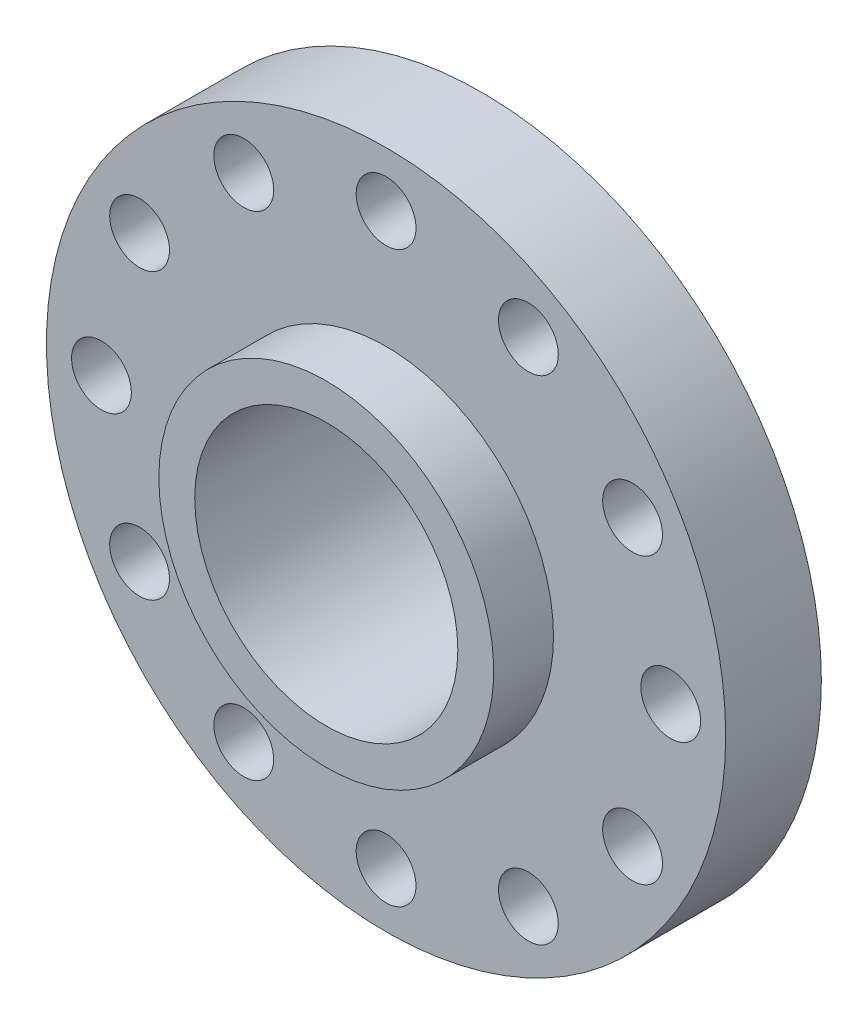
ISO-10303-21;
HEADER;
FILE_DESCRIPTION(('STEP AP214'),'2;1');
FILE_NAME('part.step','',(''),(''),'','','');
FILE_SCHEMA(('AUTOMOTIVE_DESIGN { 1 0 10303 214 1 1 1 1 }'));
ENDSEC;
DATA;
#1=APPLICATION_CONTEXT('core data for automotive mechanical design processes');
#2=APPLICATION_PROTOCOL_DEFINITION('international standard','automotive_design',2000,#1);
#3=PRODUCT_CONTEXT('',#1,'mechanical');
#4=PRODUCT('Part','Part','',(#3));
#5=PRODUCT_RELATED_PRODUCT_CATEGORY('part','',(#4));
#6=PRODUCT_DEFINITION_FORMATION('','',#4);
#7=PRODUCT_DEFINITION_CONTEXT('part definition',#1,'design');
#8=PRODUCT_DEFINITION('design','',#6,#7);
#9=PRODUCT_DEFINITION_SHAPE('','',#8);
#10=(LENGTH_UNIT() NAMED_UNIT(*) SI_UNIT(.MILLI.,.METRE.));
#11=(NAMED_UNIT(*) PLANE_ANGLE_UNIT() SI_UNIT($,.RADIAN.));
#12=(NAMED_UNIT(*) SI_UNIT($,.STERADIAN.) SOLID_ANGLE_UNIT());
#13=UNCERTAINTY_MEASURE_WITH_UNIT(LENGTH_MEASURE(1.E-05),#10,'distance_accuracy_value','');
#14=(GEOMETRIC_REPRESENTATION_CONTEXT(3) GLOBAL_UNCERTAINTY_ASSIGNED_CONTEXT((#13)) GLOBAL_UNIT_ASSIGNED_CONTEXT((#10,
#11,#12)) REPRESENTATION_CONTEXT('',''));
#15=CARTESIAN_POINT('',(0.,0.,0.));
#16=DIRECTION('',(0.,0.,1.));
#17=DIRECTION('',(1.,0.,0.));
#18=AXIS2_PLACEMENT_3D('',#15,#16,#17);
#19=CARTESIAN_POINT('',(0.,0.,4.96));
#20=DIRECTION('',(0.,0.,1.));
#21=DIRECTION('',(1.,0.,0.));
#22=AXIS2_PLACEMENT_3D('',#19,#20,#21);
#23=PLANE('',#22);
#24=CARTESIAN_POINT('',(2.85600000000004,4.94673710641669,4.96));
#25=DIRECTION('',(0.,0.,1.));
#26=DIRECTION('',(1.,0.,0.));
#27=AXIS2_PLACEMENT_3D('',#24,#25,#26);
#28=CIRCLE('',#27,0.6);
#29=CARTESIAN_POINT('',(3.45600000000004,4.94673710641669,4.96));
#30=VERTEX_POINT('',#29);
#31=EDGE_CURVE('E80',#30,#30,#28,.T.);
#32=ORIENTED_EDGE('',*,*,#31,.F.);
#33=EDGE_LOOP('',(#32));
#34=FACE_BOUND('',#33,.T.);
#35=CARTESIAN_POINT('',(4.94673710641674,2.85599999999995,4.96));
#36=DIRECTION('',(0.,0.,1.));
#37=DIRECTION('',(1.,0.,0.));
#38=AXIS2_PLACEMENT_3D('',#35,#36,#37);
#39=CIRCLE('',#38,0.6);
#40=CARTESIAN_POINT('',(5.54673710641674,2.85599999999995,4.96));
#41=VERTEX_POINT('',#40);
#42=EDGE_CURVE('E83',#41,#41,#39,.T.);
#43=ORIENTED_EDGE('',*,*,#42,.F.);
#44=EDGE_LOOP('',(#43));
#45=FACE_BOUND('',#44,.T.);
#46=CARTESIAN_POINT('',(5.712,0.,4.96));
#47=DIRECTION('',(0.,0.,1.));
#48=DIRECTION('',(1.,0.,0.));
#49=AXIS2_PLACEMENT_3D('',#46,#47,#48);
#50=CIRCLE('',#49,0.6);
#51=CARTESIAN_POINT('',(6.312,0.,4.96));
#52=VERTEX_POINT('',#51);
#53=EDGE_CURVE('E86',#52,#52,#50,.T.);
#54=ORIENTED_EDGE('',*,*,#53,.F.);
#55=EDGE_LOOP('',(#54));
#56=FACE_BOUND('',#55,.T.);
#57=CARTESIAN_POINT('',(4.94673710641668,-2.85600000000006,4.96));
#58=DIRECTION('',(0.,0.,1.));
#59=DIRECTION('',(1.,0.,0.));
#60=AXIS2_PLACEMENT_3D('',#57,#58,#59);
#61=CIRCLE('',#60,0.6);
#62=CARTESIAN_POINT('',(5.54673710641668,-2.85600000000006,4.96));
#63=VERTEX_POINT('',#62);
#64=EDGE_CURVE('E89',#63,#63,#61,.T.);
#65=ORIENTED_EDGE('',*,*,#64,.F.);
#66=EDGE_LOOP('',(#65));
#67=FACE_BOUND('',#66,.T.);
#68=CARTESIAN_POINT('',(2.85599999999997,-4.94673710641673,4.96));
#69=DIRECTION('',(0.,0.,1.));
#70=DIRECTION('',(1.,0.,0.));
#71=AXIS2_PLACEMENT_3D('',#68,#69,#70);
#72=CIRCLE('',#71,0.6);
#73=CARTESIAN_POINT('',(3.45599999999997,-4.94673710641673,4.96));
#74=VERTEX_POINT('',#73);
#75=EDGE_CURVE('E92',#74,#74,#72,.T.);
#76=ORIENTED_EDGE('',*,*,#75,.F.);
#77=EDGE_LOOP('',(#76));
#78=FACE_BOUND('',#77,.T.);
#79=CARTESIAN_POINT('',(0.,-5.712,4.96));
#80=DIRECTION('',(0.,0.,1.));
#81=DIRECTION('',(1.,0.,0.));
#82=AXIS2_PLACEMENT_3D('',#79,#80,#81);
#83=CIRCLE('',#82,0.6);
#84=CARTESIAN_POINT('',(0.599999999999921,-5.712,4.96));
#85=VERTEX_POINT('',#84);
#86=EDGE_CURVE('E95',#85,#85,#83,.T.);
#87=ORIENTED_EDGE('',*,*,#86,.F.);
#88=EDGE_LOOP('',(#87));
#89=FACE_BOUND('',#88,.T.);
#90=CARTESIAN_POINT('',(-2.85600000000007,-4.94673710641667,4.96));
#91=DIRECTION('',(0.,0.,1.));
#92=DIRECTION('',(1.,0.,0.));
#93=AXIS2_PLACEMENT_3D('',#90,#91,#92);
#94=CIRCLE('',#93,0.6);
#95=CARTESIAN_POINT('',(-2.25600000000007,-4.94673710641667,4.96));
#96=VERTEX_POINT('',#95);
#97=EDGE_CURVE('E98',#96,#96,#94,.T.);
#98=ORIENTED_EDGE('',*,*,#97,.F.);
#99=EDGE_LOOP('',(#98));
#100=FACE_BOUND('',#99,.T.);
#101=CARTESIAN_POINT('',(-4.94673710641676,-2.85599999999992,4.96));
#102=DIRECTION('',(0.,0.,1.));
#103=DIRECTION('',(1.,0.,0.));
#104=AXIS2_PLACEMENT_3D('',#101,#102,#103);
#105=CIRCLE('',#104,0.6);
#106=CARTESIAN_POINT('',(-4.34673710641676,-2.85599999999992,4.96));
#107=VERTEX_POINT('',#106);
#108=EDGE_CURVE('E101',#107,#107,#105,.T.);
#109=ORIENTED_EDGE('',*,*,#108,.F.);
#110=EDGE_LOOP('',(#109));
#111=FACE_BOUND('',#110,.T.);
#112=CARTESIAN_POINT('',(-5.712,0.,4.96));
#113=DIRECTION('',(0.,0.,1.));
#114=DIRECTION('',(1.,0.,0.));
#115=AXIS2_PLACEMENT_3D('',#112,#113,#114);
#116=CIRCLE('',#115,0.6);
#117=CARTESIAN_POINT('',(-5.112,0.,4.96));
#118=VERTEX_POINT('',#117);
#119=EDGE_CURVE('E104',#118,#118,#116,.T.);
#120=ORIENTED_EDGE('',*,*,#119,.F.);
#121=EDGE_LOOP('',(#120));
#122=FACE_BOUND('',#121,.T.);
#123=CARTESIAN_POINT('',(-4.94673710641666,2.85600000000009,4.96));
#124=DIRECTION('',(0.,0.,1.));
#125=DIRECTION('',(1.,0.,0.));
#126=AXIS2_PLACEMENT_3D('',#123,#124,#125);
#127=CIRCLE('',#126,0.6);
#128=CARTESIAN_POINT('',(-4.34673710641666,2.85600000000009,4.96));
#129=VERTEX_POINT('',#128);
#130=EDGE_CURVE('E107',#129,#129,#127,.T.);
#131=ORIENTED_EDGE('',*,*,#130,.F.);
#132=EDGE_LOOP('',(#131));
#133=FACE_BOUND('',#132,.T.);
#134=CARTESIAN_POINT('',(0.,5.712,4.96));
#135=DIRECTION('',(0.,0.,1.));
#136=DIRECTION('',(1.,0.,0.));
#137=AXIS2_PLACEMENT_3D('',#134,#135,#136);
#138=CIRCLE('',#137,0.6);
#139=CARTESIAN_POINT('',(0.600000000000044,5.712,4.96));
#140=VERTEX_POINT('',#139);
#141=EDGE_CURVE('E74',#140,#140,#138,.T.);
#142=ORIENTED_EDGE('',*,*,#141,.F.);
#143=EDGE_LOOP('',(#142));
#144=FACE_BOUND('',#143,.T.);
#145=CARTESIAN_POINT('',(-2.85599999999997,4.94673710641673,4.96));
#146=DIRECTION('',(0.,0.,1.));
#147=DIRECTION('',(1.,0.,0.));
#148=AXIS2_PLACEMENT_3D('',#145,#146,#147);
#149=CIRCLE('',#148,0.6);
#150=CARTESIAN_POINT('',(-2.25599999999997,4.94673710641673,4.96));
#151=VERTEX_POINT('',#150);
#152=EDGE_CURVE('E68',#151,#151,#149,.T.);
#153=ORIENTED_EDGE('',*,*,#152,.F.);
#154=EDGE_LOOP('',(#153));
#155=FACE_BOUND('',#154,.T.);
#156=CARTESIAN_POINT('',(0.,0.,4.96));
#157=DIRECTION('',(0.,0.,1.));
#158=DIRECTION('',(1.,0.,0.));
#159=AXIS2_PLACEMENT_3D('',#156,#157,#158);
#160=CIRCLE('',#159,3.36);
#161=CARTESIAN_POINT('',(3.36,0.,4.96));
#162=VERTEX_POINT('',#161);
#163=EDGE_CURVE('E10',#162,#162,#160,.T.);
#164=ORIENTED_EDGE('',*,*,#163,.F.);
#165=EDGE_LOOP('',(#164));
#166=FACE_BOUND('',#165,.T.);
#167=CARTESIAN_POINT('',(0.,0.,4.96));
#168=DIRECTION('',(0.,0.,1.));
#169=DIRECTION('',(1.,0.,0.));
#170=AXIS2_PLACEMENT_3D('',#167,#168,#169);
#171=CIRCLE('',#170,6.816);
#172=CARTESIAN_POINT('',(6.816,0.,4.96));
#173=VERTEX_POINT('',#172);
#174=EDGE_CURVE('E47',#173,#173,#171,.T.);
#175=ORIENTED_EDGE('',*,*,#174,.T.);
#176=EDGE_LOOP('',(#175));
#177=FACE_BOUND('',#176,.T.);
#178=ADVANCED_FACE('F36',(#34,#45,#56,#67,#78,#89,#100,#111,#122,#133,#144,#155,#166,#177),#23,.T.);
#179=CARTESIAN_POINT('',(0.,0.,3.04));
#180=DIRECTION('',(0.,0.,1.));
#181=DIRECTION('',(1.,0.,0.));
#182=AXIS2_PLACEMENT_3D('',#179,#180,#181);
#183=PLANE('',#182);
#184=CARTESIAN_POINT('',(2.85600000000004,4.94673710641669,3.04));
#185=DIRECTION('',(0.,0.,-1.));
#186=DIRECTION('',(-0.499999999999998,0.86602540378444,0.));
#187=AXIS2_PLACEMENT_3D('',#184,#185,#186);
#188=CIRCLE('',#187,0.6);
#189=CARTESIAN_POINT('',(2.55600000000005,5.46635234868735,3.04));
#190=VERTEX_POINT('',#189);
#191=EDGE_CURVE('E110',#190,#190,#188,.T.);
#192=ORIENTED_EDGE('',*,*,#191,.F.);
#193=EDGE_LOOP('',(#192));
#194=FACE_BOUND('',#193,.T.);
#195=CARTESIAN_POINT('',(4.94673710641674,2.85599999999995,3.04));
#196=DIRECTION('',(0.,0.,-1.));
#197=DIRECTION('',(0.,1.,0.));
#198=AXIS2_PLACEMENT_3D('',#195,#196,#197);
#199=CIRCLE('',#198,0.6);
#200=CARTESIAN_POINT('',(4.94673710641674,3.45599999999995,3.04));
#201=VERTEX_POINT('',#200);
#202=EDGE_CURVE('E135',#201,#201,#199,.T.);
#203=ORIENTED_EDGE('',*,*,#202,.F.);
#204=EDGE_LOOP('',(#203));
#205=FACE_BOUND('',#204,.T.);
#206=CARTESIAN_POINT('',(5.712,0.,3.04));
#207=DIRECTION('',(0.,0.,-1.));
#208=DIRECTION('',(0.500000000000004,0.866025403784436,0.));
#209=AXIS2_PLACEMENT_3D('',#206,#207,#208);
#210=CIRCLE('',#209,0.6);
#211=CARTESIAN_POINT('',(6.01200000000001,0.519615242270597,3.04));
#212=VERTEX_POINT('',#211);
#213=EDGE_CURVE('E132',#212,#212,#210,.T.);
#214=ORIENTED_EDGE('',*,*,#213,.F.);
#215=EDGE_LOOP('',(#214));
#216=FACE_BOUND('',#215,.T.);
#217=CARTESIAN_POINT('',(4.94673710641668,-2.85600000000006,3.04));
#218=DIRECTION('',(0.,0.,-1.));
#219=DIRECTION('',(0.866025403784442,0.499999999999995,0.));
#220=AXIS2_PLACEMENT_3D('',#217,#218,#219);
#221=CIRCLE('',#220,0.6);
#222=CARTESIAN_POINT('',(5.46635234868735,-2.55600000000007,3.04));
#223=VERTEX_POINT('',#222);
#224=EDGE_CURVE('E129',#223,#223,#221,.T.);
#225=ORIENTED_EDGE('',*,*,#224,.F.);
#226=EDGE_LOOP('',(#225));
#227=FACE_BOUND('',#226,.T.);
#228=CARTESIAN_POINT('',(2.85599999999997,-4.94673710641673,3.04));
#229=DIRECTION('',(0.,0.,-1.));
#230=DIRECTION('',(1.,0.,0.));
#231=AXIS2_PLACEMENT_3D('',#228,#229,#230);
#232=CIRCLE('',#231,0.6);
#233=CARTESIAN_POINT('',(3.45599999999997,-4.94673710641673,3.04));
#234=VERTEX_POINT('',#233);
#235=EDGE_CURVE('E126',#234,#234,#232,.T.);
#236=ORIENTED_EDGE('',*,*,#235,.F.);
#237=EDGE_LOOP('',(#236));
#238=FACE_BOUND('',#237,.T.);
#239=CARTESIAN_POINT('',(0.,-5.712,3.04));
#240=DIRECTION('',(0.,0.,-1.));
#241=DIRECTION('',(0.866025403784435,-0.500000000000007,0.));
#242=AXIS2_PLACEMENT_3D('',#239,#240,#241);
#243=CIRCLE('',#242,0.6);
#244=CARTESIAN_POINT('',(0.519615242270582,-6.01200000000001,3.04));
#245=VERTEX_POINT('',#244);
#246=EDGE_CURVE('E123',#245,#245,#243,.T.);
#247=ORIENTED_EDGE('',*,*,#246,.F.);
#248=EDGE_LOOP('',(#247));
#249=FACE_BOUND('',#248,.T.);
#250=CARTESIAN_POINT('',(-2.85600000000007,-4.94673710641667,3.04));
#251=DIRECTION('',(0.,0.,-1.));
#252=DIRECTION('',(0.499999999999992,-0.866025403784443,0.));
#253=AXIS2_PLACEMENT_3D('',#250,#251,#252);
#254=CIRCLE('',#253,0.6);
#255=CARTESIAN_POINT('',(-2.55600000000008,-5.46635234868734,3.04));
#256=VERTEX_POINT('',#255);
#257=EDGE_CURVE('E120',#256,#256,#254,.T.);
#258=ORIENTED_EDGE('',*,*,#257,.F.);
#259=EDGE_LOOP('',(#258));
#260=FACE_BOUND('',#259,.T.);
#261=CARTESIAN_POINT('',(-4.94673710641676,-2.85599999999992,3.04));
#262=DIRECTION('',(0.,0.,-1.));
#263=DIRECTION('',(0.,-1.,0.));
#264=AXIS2_PLACEMENT_3D('',#261,#262,#263);
#265=CIRCLE('',#264,0.6);
#266=CARTESIAN_POINT('',(-4.94673710641676,-3.45599999999992,3.04));
#267=VERTEX_POINT('',#266);
#268=EDGE_CURVE('E117',#267,#267,#265,.T.);
#269=ORIENTED_EDGE('',*,*,#268,.F.);
#270=EDGE_LOOP('',(#269));
#271=FACE_BOUND('',#270,.T.);
#272=CARTESIAN_POINT('',(-5.712,0.,3.04));
#273=DIRECTION('',(0.,0.,-1.));
#274=DIRECTION('',(-0.50000000000001,-0.866025403784433,0.));
#275=AXIS2_PLACEMENT_3D('',#272,#273,#274);
#276=CIRCLE('',#275,0.6);
#277=CARTESIAN_POINT('',(-6.012,-0.519615242270562,3.04));
#278=VERTEX_POINT('',#277);
#279=EDGE_CURVE('E114',#278,#278,#276,.T.);
#280=ORIENTED_EDGE('',*,*,#279,.F.);
#281=EDGE_LOOP('',(#280));
#282=FACE_BOUND('',#281,.T.);
#283=CARTESIAN_POINT('',(-4.94673710641666,2.85600000000009,3.04));
#284=DIRECTION('',(0.,0.,-1.));
#285=DIRECTION('',(-0.866025403784445,-0.499999999999989,0.));
#286=AXIS2_PLACEMENT_3D('',#283,#284,#285);
#287=CIRCLE('',#286,0.6);
#288=CARTESIAN_POINT('',(-5.46635234868733,2.5560000000001,3.04));
#289=VERTEX_POINT('',#288);
#290=EDGE_CURVE('E111',#289,#289,#287,.T.);
#291=ORIENTED_EDGE('',*,*,#290,.F.);
#292=EDGE_LOOP('',(#291));
#293=FACE_BOUND('',#292,.T.);
#294=CARTESIAN_POINT('',(0.,5.712,3.04));
#295=DIRECTION('',(0.,0.,-1.));
#296=DIRECTION('',(-0.866025403784438,0.500000000000001,0.));
#297=AXIS2_PLACEMENT_3D('',#294,#295,#296);
#298=CIRCLE('',#297,0.6);
#299=CARTESIAN_POINT('',(-0.519615242270619,6.012,3.04));
#300=VERTEX_POINT('',#299);
#301=EDGE_CURVE('E77',#300,#300,#298,.T.);
#302=ORIENTED_EDGE('',*,*,#301,.F.);
#303=EDGE_LOOP('',(#302));
#304=FACE_BOUND('',#303,.T.);
#305=CARTESIAN_POINT('',(-2.85599999999997,4.94673710641673,3.04));
#306=DIRECTION('',(0.,0.,-1.));
#307=DIRECTION('',(-1.,0.,0.));
#308=AXIS2_PLACEMENT_3D('',#305,#306,#307);
#309=CIRCLE('',#308,0.6);
#310=CARTESIAN_POINT('',(-3.45599999999997,4.94673710641673,3.04));
#311=VERTEX_POINT('',#310);
#312=EDGE_CURVE('E71',#311,#311,#309,.T.);
#313=ORIENTED_EDGE('',*,*,#312,.F.);
#314=EDGE_LOOP('',(#313));
#315=FACE_BOUND('',#314,.T.);
#316=CARTESIAN_POINT('',(0.,0.,3.04));
#317=DIRECTION('',(0.,0.,1.));
#318=DIRECTION('',(1.,0.,0.));
#319=AXIS2_PLACEMENT_3D('',#316,#317,#318);
#320=CIRCLE('',#319,3.36);
#321=CARTESIAN_POINT('',(3.36,0.,3.04));
#322=VERTEX_POINT('',#321);
#323=EDGE_CURVE('E43',#322,#322,#320,.F.);
#324=ORIENTED_EDGE('',*,*,#323,.F.);
#325=EDGE_LOOP('',(#324));
#326=FACE_BOUND('',#325,.T.);
#327=CARTESIAN_POINT('',(0.,0.,3.04));
#328=DIRECTION('',(0.,0.,1.));
#329=DIRECTION('',(1.,0.,0.));
#330=AXIS2_PLACEMENT_3D('',#327,#328,#329);
#331=CIRCLE('',#330,6.816);
#332=CARTESIAN_POINT('',(6.816,0.,3.04));
#333=VERTEX_POINT('',#332);
#334=EDGE_CURVE('E51',#333,#333,#331,.T.);
#335=ORIENTED_EDGE('',*,*,#334,.F.);
#336=EDGE_LOOP('',(#335));
#337=FACE_BOUND('',#336,.T.);
#338=ADVANCED_FACE('F143',(#194,#205,#216,#227,#238,#249,#260,#271,#282,#293,#304,#315,#326,
#337),#183,.F.);
#339=CARTESIAN_POINT('',(0.,0.,4.96));
#340=DIRECTION('',(0.,0.,-1.));
#341=DIRECTION('',(-1.,0.,0.));
#342=AXIS2_PLACEMENT_3D('',#339,#340,#341);
#343=CYLINDRICAL_SURFACE('',#342,6.816);
#344=ORIENTED_EDGE('',*,*,#174,.F.);
#345=EDGE_LOOP('',(#344));
#346=FACE_BOUND('',#345,.T.);
#347=ORIENTED_EDGE('',*,*,#334,.T.);
#348=EDGE_LOOP('',(#347));
#349=FACE_BOUND('',#348,.T.);
#350=ADVANCED_FACE('F38',(#346,#349),#343,.T.);
#351=CARTESIAN_POINT('',(0.,0.,4.96));
#352=DIRECTION('',(0.,0.,-1.));
#353=DIRECTION('',(-1.,0.,0.));
#354=AXIS2_PLACEMENT_3D('',#351,#352,#353);
#355=CYLINDRICAL_SURFACE('',#354,2.64);
#356=CARTESIAN_POINT('',(0.,0.,1.84));
#357=DIRECTION('',(0.,0.,-1.));
#358=DIRECTION('',(-1.,0.,0.));
#359=AXIS2_PLACEMENT_3D('',#356,#357,#358);
#360=CIRCLE('',#359,2.64);
#361=CARTESIAN_POINT('',(-2.64,0.,1.84));
#362=VERTEX_POINT('',#361);
#363=EDGE_CURVE('E59',#362,#362,#360,.F.);
#364=ORIENTED_EDGE('',*,*,#363,.F.);
#365=EDGE_LOOP('',(#364));
#366=FACE_BOUND('',#365,.T.);
#367=CARTESIAN_POINT('',(0.,0.,6.16));
#368=DIRECTION('',(0.,0.,-1.));
#369=DIRECTION('',(-1.,0.,0.));
#370=AXIS2_PLACEMENT_3D('',#367,#368,#369);
#371=CIRCLE('',#370,2.64);
#372=CARTESIAN_POINT('',(-2.64,0.,6.16));
#373=VERTEX_POINT('',#372);
#374=EDGE_CURVE('E65',#373,#373,#371,.F.);
#375=ORIENTED_EDGE('',*,*,#374,.T.);
#376=EDGE_LOOP('',(#375));
#377=FACE_BOUND('',#376,.T.);
#378=ADVANCED_FACE('F172',(#366,#377),#355,.F.);
#379=CARTESIAN_POINT('',(0.,0.,1.84));
#380=DIRECTION('',(0.,0.,1.));
#381=DIRECTION('',(1.,0.,0.));
#382=AXIS2_PLACEMENT_3D('',#379,#380,#381);
#383=CYLINDRICAL_SURFACE('',#382,3.36);
#384=CARTESIAN_POINT('',(0.,0.,1.84));
#385=DIRECTION('',(0.,0.,-1.));
#386=DIRECTION('',(-1.,0.,0.));
#387=AXIS2_PLACEMENT_3D('',#384,#385,#386);
#388=CIRCLE('',#387,3.36);
#389=CARTESIAN_POINT('',(-3.36,0.,1.84));
#390=VERTEX_POINT('',#389);
#391=EDGE_CURVE('E55',#390,#390,#388,.T.);
#392=ORIENTED_EDGE('',*,*,#391,.F.);
#393=EDGE_LOOP('',(#392));
#394=FACE_BOUND('',#393,.T.);
#395=ORIENTED_EDGE('',*,*,#323,.T.);
#396=EDGE_LOOP('',(#395));
#397=FACE_BOUND('',#396,.T.);
#398=ADVANCED_FACE('F177',(#394,#397),#383,.T.);
#399=CARTESIAN_POINT('',(0.,0.,1.84));
#400=DIRECTION('',(0.,0.,-1.));
#401=DIRECTION('',(-1.,0.,0.));
#402=AXIS2_PLACEMENT_3D('',#399,#400,#401);
#403=PLANE('',#402);
#404=ORIENTED_EDGE('',*,*,#363,.T.);
#405=EDGE_LOOP('',(#404));
#406=FACE_BOUND('',#405,.T.);
#407=ORIENTED_EDGE('',*,*,#391,.T.);
#408=EDGE_LOOP('',(#407));
#409=FACE_BOUND('',#408,.T.);
#410=ADVANCED_FACE('F191',(#406,#409),#403,.T.);
#411=CARTESIAN_POINT('',(0.,0.,6.16));
#412=DIRECTION('',(0.,0.,-1.));
#413=DIRECTION('',(-1.,0.,0.));
#414=AXIS2_PLACEMENT_3D('',#411,#412,#413);
#415=CYLINDRICAL_SURFACE('',#414,3.36);
#416=CARTESIAN_POINT('',(0.,0.,6.16));
#417=DIRECTION('',(0.,0.,-1.));
#418=DIRECTION('',(-1.,0.,0.));
#419=AXIS2_PLACEMENT_3D('',#416,#417,#418);
#420=CIRCLE('',#419,3.36);
#421=CARTESIAN_POINT('',(-3.36,0.,6.16));
#422=VERTEX_POINT('',#421);
#423=EDGE_CURVE('E62',#422,#422,#420,.T.);
#424=ORIENTED_EDGE('',*,*,#423,.T.);
#425=EDGE_LOOP('',(#424));
#426=FACE_BOUND('',#425,.T.);
#427=ORIENTED_EDGE('',*,*,#163,.T.);
#428=EDGE_LOOP('',(#427));
#429=FACE_BOUND('',#428,.T.);
#430=ADVANCED_FACE('F195',(#426,#429),#415,.T.);
#431=CARTESIAN_POINT('',(0.,0.,6.16));
#432=DIRECTION('',(0.,0.,1.));
#433=DIRECTION('',(-1.,0.,0.));
#434=AXIS2_PLACEMENT_3D('',#431,#432,#433);
#435=PLANE('',#434);
#436=ORIENTED_EDGE('',*,*,#374,.F.);
#437=EDGE_LOOP('',(#436));
#438=FACE_BOUND('',#437,.T.);
#439=ORIENTED_EDGE('',*,*,#423,.F.);
#440=EDGE_LOOP('',(#439));
#441=FACE_BOUND('',#440,.T.);
#442=ADVANCED_FACE('F199',(#438,#441),#435,.T.);
#443=CARTESIAN_POINT('',(-2.85599999999997,4.94673710641673,6.16));
#444=DIRECTION('',(0.,0.,-1.));
#445=DIRECTION('',(-1.,0.,0.));
#446=AXIS2_PLACEMENT_3D('',#443,#444,#445);
#447=CYLINDRICAL_SURFACE('',#446,0.6);
#448=ORIENTED_EDGE('',*,*,#152,.T.);
#449=EDGE_LOOP('',(#448));
#450=FACE_BOUND('',#449,.T.);
#451=ORIENTED_EDGE('',*,*,#312,.T.);
#452=EDGE_LOOP('',(#451));
#453=FACE_BOUND('',#452,.T.);
#454=ADVANCED_FACE('F203',(#450,#453),#447,.F.);
#455=CARTESIAN_POINT('',(0.,5.712,6.16));
#456=DIRECTION('',(0.,0.,-1.));
#457=DIRECTION('',(-1.,0.,0.));
#458=AXIS2_PLACEMENT_3D('',#455,#456,#457);
#459=CYLINDRICAL_SURFACE('',#458,0.6);
#460=ORIENTED_EDGE('',*,*,#141,.T.);
#461=EDGE_LOOP('',(#460));
#462=FACE_BOUND('',#461,.T.);
#463=ORIENTED_EDGE('',*,*,#301,.T.);
#464=EDGE_LOOP('',(#463));
#465=FACE_BOUND('',#464,.T.);
#466=ADVANCED_FACE('F207',(#462,#465),#459,.F.);
#467=CARTESIAN_POINT('',(-4.94673710641666,2.85600000000009,6.16));
#468=DIRECTION('',(0.,0.,-1.));
#469=DIRECTION('',(-1.,0.,0.));
#470=AXIS2_PLACEMENT_3D('',#467,#468,#469);
#471=CYLINDRICAL_SURFACE('',#470,0.6);
#472=ORIENTED_EDGE('',*,*,#130,.T.);
#473=EDGE_LOOP('',(#472));
#474=FACE_BOUND('',#473,.T.);
#475=ORIENTED_EDGE('',*,*,#290,.T.);
#476=EDGE_LOOP('',(#475));
#477=FACE_BOUND('',#476,.T.);
#478=ADVANCED_FACE('F211',(#474,#477),#471,.F.);
#479=CARTESIAN_POINT('',(-5.712,0.,6.16));
#480=DIRECTION('',(0.,0.,-1.));
#481=DIRECTION('',(-1.,0.,0.));
#482=AXIS2_PLACEMENT_3D('',#479,#480,#481);
#483=CYLINDRICAL_SURFACE('',#482,0.6);
#484=ORIENTED_EDGE('',*,*,#119,.T.);
#485=EDGE_LOOP('',(#484));
#486=FACE_BOUND('',#485,.T.);
#487=ORIENTED_EDGE('',*,*,#279,.T.);
#488=EDGE_LOOP('',(#487));
#489=FACE_BOUND('',#488,.T.);
#490=ADVANCED_FACE('F215',(#486,#489),#483,.F.);
#491=CARTESIAN_POINT('',(-4.94673710641676,-2.85599999999992,6.16));
#492=DIRECTION('',(0.,0.,-1.));
#493=DIRECTION('',(-1.,0.,0.));
#494=AXIS2_PLACEMENT_3D('',#491,#492,#493);
#495=CYLINDRICAL_SURFACE('',#494,0.6);
#496=ORIENTED_EDGE('',*,*,#108,.T.);
#497=EDGE_LOOP('',(#496));
#498=FACE_BOUND('',#497,.T.);
#499=ORIENTED_EDGE('',*,*,#268,.T.);
#500=EDGE_LOOP('',(#499));
#501=FACE_BOUND('',#500,.T.);
#502=ADVANCED_FACE('F219',(#498,#501),#495,.F.);
#503=CARTESIAN_POINT('',(-2.85600000000007,-4.94673710641667,6.16));
#504=DIRECTION('',(0.,0.,-1.));
#505=DIRECTION('',(-1.,0.,0.));
#506=AXIS2_PLACEMENT_3D('',#503,#504,#505);
#507=CYLINDRICAL_SURFACE('',#506,0.6);
#508=ORIENTED_EDGE('',*,*,#97,.T.);
#509=EDGE_LOOP('',(#508));
#510=FACE_BOUND('',#509,.T.);
#511=ORIENTED_EDGE('',*,*,#257,.T.);
#512=EDGE_LOOP('',(#511));
#513=FACE_BOUND('',#512,.T.);
#514=ADVANCED_FACE('F223',(#510,#513),#507,.F.);
#515=CARTESIAN_POINT('',(0.,-5.712,6.16));
#516=DIRECTION('',(0.,0.,-1.));
#517=DIRECTION('',(-1.,0.,0.));
#518=AXIS2_PLACEMENT_3D('',#515,#516,#517);
#519=CYLINDRICAL_SURFACE('',#518,0.6);
#520=ORIENTED_EDGE('',*,*,#86,.T.);
#521=EDGE_LOOP('',(#520));
#522=FACE_BOUND('',#521,.T.);
#523=ORIENTED_EDGE('',*,*,#246,.T.);
#524=EDGE_LOOP('',(#523));
#525=FACE_BOUND('',#524,.T.);
#526=ADVANCED_FACE('F227',(#522,#525),#519,.F.);
#527=CARTESIAN_POINT('',(2.85599999999997,-4.94673710641673,6.16));
#528=DIRECTION('',(0.,0.,-1.));
#529=DIRECTION('',(-1.,0.,0.));
#530=AXIS2_PLACEMENT_3D('',#527,#528,#529);
#531=CYLINDRICAL_SURFACE('',#530,0.6);
#532=ORIENTED_EDGE('',*,*,#75,.T.);
#533=EDGE_LOOP('',(#532));
#534=FACE_BOUND('',#533,.T.);
#535=ORIENTED_EDGE('',*,*,#235,.T.);
#536=EDGE_LOOP('',(#535));
#537=FACE_BOUND('',#536,.T.);
#538=ADVANCED_FACE('F231',(#534,#537),#531,.F.);
#539=CARTESIAN_POINT('',(4.94673710641668,-2.85600000000006,6.16));
#540=DIRECTION('',(0.,0.,-1.));
#541=DIRECTION('',(-1.,0.,0.));
#542=AXIS2_PLACEMENT_3D('',#539,#540,#541);
#543=CYLINDRICAL_SURFACE('',#542,0.6);
#544=ORIENTED_EDGE('',*,*,#64,.T.);
#545=EDGE_LOOP('',(#544));
#546=FACE_BOUND('',#545,.T.);
#547=ORIENTED_EDGE('',*,*,#224,.T.);
#548=EDGE_LOOP('',(#547));
#549=FACE_BOUND('',#548,.T.);
#550=ADVANCED_FACE('F235',(#546,#549),#543,.F.);
#551=CARTESIAN_POINT('',(5.712,0.,6.16));
#552=DIRECTION('',(0.,0.,-1.));
#553=DIRECTION('',(-1.,0.,0.));
#554=AXIS2_PLACEMENT_3D('',#551,#552,#553);
#555=CYLINDRICAL_SURFACE('',#554,0.6);
#556=ORIENTED_EDGE('',*,*,#53,.T.);
#557=EDGE_LOOP('',(#556));
#558=FACE_BOUND('',#557,.T.);
#559=ORIENTED_EDGE('',*,*,#213,.T.);
#560=EDGE_LOOP('',(#559));
#561=FACE_BOUND('',#560,.T.);
#562=ADVANCED_FACE('F239',(#558,#561),#555,.F.);
#563=CARTESIAN_POINT('',(4.94673710641674,2.85599999999995,6.16));
#564=DIRECTION('',(0.,0.,-1.));
#565=DIRECTION('',(-1.,0.,0.));
#566=AXIS2_PLACEMENT_3D('',#563,#564,#565);
#567=CYLINDRICAL_SURFACE('',#566,0.6);
#568=ORIENTED_EDGE('',*,*,#42,.T.);
#569=EDGE_LOOP('',(#568));
#570=FACE_BOUND('',#569,.T.);
#571=ORIENTED_EDGE('',*,*,#202,.T.);
#572=EDGE_LOOP('',(#571));
#573=FACE_BOUND('',#572,.T.);
#574=ADVANCED_FACE('F243',(#570,#573),#567,.F.);
#575=CARTESIAN_POINT('',(2.85600000000004,4.94673710641669,6.16));
#576=DIRECTION('',(0.,0.,-1.));
#577=DIRECTION('',(-1.,0.,0.));
#578=AXIS2_PLACEMENT_3D('',#575,#576,#577);
#579=CYLINDRICAL_SURFACE('',#578,0.6);
#580=ORIENTED_EDGE('',*,*,#31,.T.);
#581=EDGE_LOOP('',(#580));
#582=FACE_BOUND('',#581,.T.);
#583=ORIENTED_EDGE('',*,*,#191,.T.);
#584=EDGE_LOOP('',(#583));
#585=FACE_BOUND('',#584,.T.);
#586=ADVANCED_FACE('F141',(#582,#585),#579,.F.);
#587=CLOSED_SHELL('',(#178,#338,#350,#378,#398,#410,#430,#442,#454,#466,#478,#490,#502,#514,
#526,#538,#550,#562,#574,#586));
#588=MANIFOLD_SOLID_BREP('B2',#587);
#589=ADVANCED_BREP_SHAPE_REPRESENTATION('',(#18,#588),#14);
#590=SHAPE_DEFINITION_REPRESENTATION(#9,#589);
ENDSEC;
END-ISO-10303-21;
